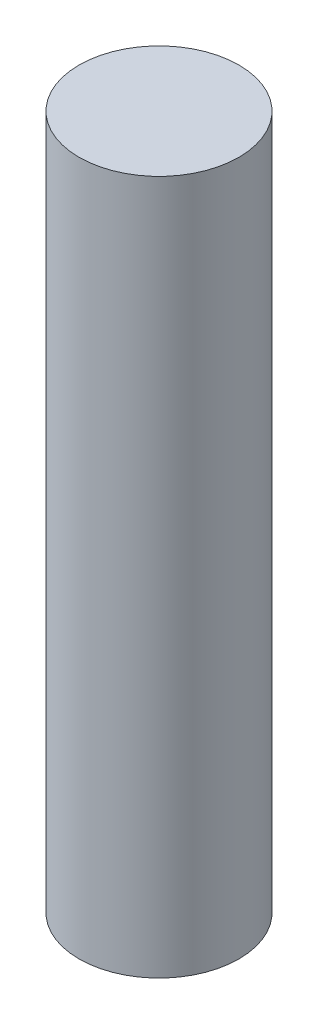
ISO-10303-21;
HEADER;
FILE_DESCRIPTION(('STEP AP214'),'2;1');
FILE_NAME('part.step','',(''),(''),'','','');
FILE_SCHEMA(('AUTOMOTIVE_DESIGN { 1 0 10303 214 1 1 1 1 }'));
ENDSEC;
DATA;
#1=APPLICATION_CONTEXT('core data for automotive mechanical design processes');
#2=APPLICATION_PROTOCOL_DEFINITION('international standard','automotive_design',2000,#1);
#3=PRODUCT_CONTEXT('',#1,'mechanical');
#4=PRODUCT('Part','Part','',(#3));
#5=PRODUCT_RELATED_PRODUCT_CATEGORY('part','',(#4));
#6=PRODUCT_DEFINITION_FORMATION('','',#4);
#7=PRODUCT_DEFINITION_CONTEXT('part definition',#1,'design');
#8=PRODUCT_DEFINITION('design','',#6,#7);
#9=PRODUCT_DEFINITION_SHAPE('','',#8);
#10=(LENGTH_UNIT() NAMED_UNIT(*) SI_UNIT(.MILLI.,.METRE.));
#11=(NAMED_UNIT(*) PLANE_ANGLE_UNIT() SI_UNIT($,.RADIAN.));
#12=(NAMED_UNIT(*) SI_UNIT($,.STERADIAN.) SOLID_ANGLE_UNIT());
#13=UNCERTAINTY_MEASURE_WITH_UNIT(LENGTH_MEASURE(1.E-05),#10,'distance_accuracy_value','');
#14=(GEOMETRIC_REPRESENTATION_CONTEXT(3) GLOBAL_UNCERTAINTY_ASSIGNED_CONTEXT((#13)) GLOBAL_UNIT_ASSIGNED_CONTEXT((#10,
#11,#12)) REPRESENTATION_CONTEXT('',''));
#15=CARTESIAN_POINT('',(0.,0.,0.));
#16=DIRECTION('',(0.,0.,1.));
#17=DIRECTION('',(1.,0.,0.));
#18=AXIS2_PLACEMENT_3D('',#15,#16,#17);
#19=CARTESIAN_POINT('',(0.,39.,0.));
#20=DIRECTION('',(0.,-1.,0.));
#21=DIRECTION('',(0.,0.,-1.));
#22=AXIS2_PLACEMENT_3D('',#19,#20,#21);
#23=CYLINDRICAL_SURFACE('',#22,4.49);
#24=CARTESIAN_POINT('',(0.,39.,0.));
#25=DIRECTION('',(0.,1.,0.));
#26=DIRECTION('',(0.,0.,1.));
#27=AXIS2_PLACEMENT_3D('',#24,#25,#26);
#28=CIRCLE('',#27,4.49);
#29=CARTESIAN_POINT('',(0.,39.,4.49));
#30=VERTEX_POINT('',#29);
#31=EDGE_CURVE('E10',#30,#30,#28,.T.);
#32=ORIENTED_EDGE('',*,*,#31,.F.);
#33=EDGE_LOOP('',(#32));
#34=FACE_BOUND('',#33,.T.);
#35=CARTESIAN_POINT('',(0.,0.,0.));
#36=DIRECTION('',(0.,1.,0.));
#37=DIRECTION('',(0.,0.,1.));
#38=AXIS2_PLACEMENT_3D('',#35,#36,#37);
#39=CIRCLE('',#38,4.49);
#40=CARTESIAN_POINT('',(0.,0.,4.49));
#41=VERTEX_POINT('',#40);
#42=EDGE_CURVE('E36',#41,#41,#39,.T.);
#43=ORIENTED_EDGE('',*,*,#42,.T.);
#44=EDGE_LOOP('',(#43));
#45=FACE_BOUND('',#44,.T.);
#46=ADVANCED_FACE('F33',(#34,#45),#23,.T.);
#47=CARTESIAN_POINT('',(0.,39.,0.));
#48=DIRECTION('',(0.,1.,0.));
#49=DIRECTION('',(0.,0.,1.));
#50=AXIS2_PLACEMENT_3D('',#47,#48,#49);
#51=PLANE('',#50);
#52=ORIENTED_EDGE('',*,*,#31,.T.);
#53=EDGE_LOOP('',(#52));
#54=FACE_BOUND('',#53,.T.);
#55=ADVANCED_FACE('F48',(#54),#51,.T.);
#56=CARTESIAN_POINT('',(0.,0.,0.));
#57=DIRECTION('',(0.,1.,0.));
#58=DIRECTION('',(0.,0.,1.));
#59=AXIS2_PLACEMENT_3D('',#56,#57,#58);
#60=PLANE('',#59);
#61=ORIENTED_EDGE('',*,*,#42,.F.);
#62=EDGE_LOOP('',(#61));
#63=FACE_BOUND('',#62,.T.);
#64=ADVANCED_FACE('F46',(#63),#60,.F.);
#65=CLOSED_SHELL('',(#46,#55,#64));
#66=MANIFOLD_SOLID_BREP('B2',#65);
#67=ADVANCED_BREP_SHAPE_REPRESENTATION('',(#18,#66),#14);
#68=SHAPE_DEFINITION_REPRESENTATION(#9,#67);
ENDSEC;
END-ISO-10303-21;
